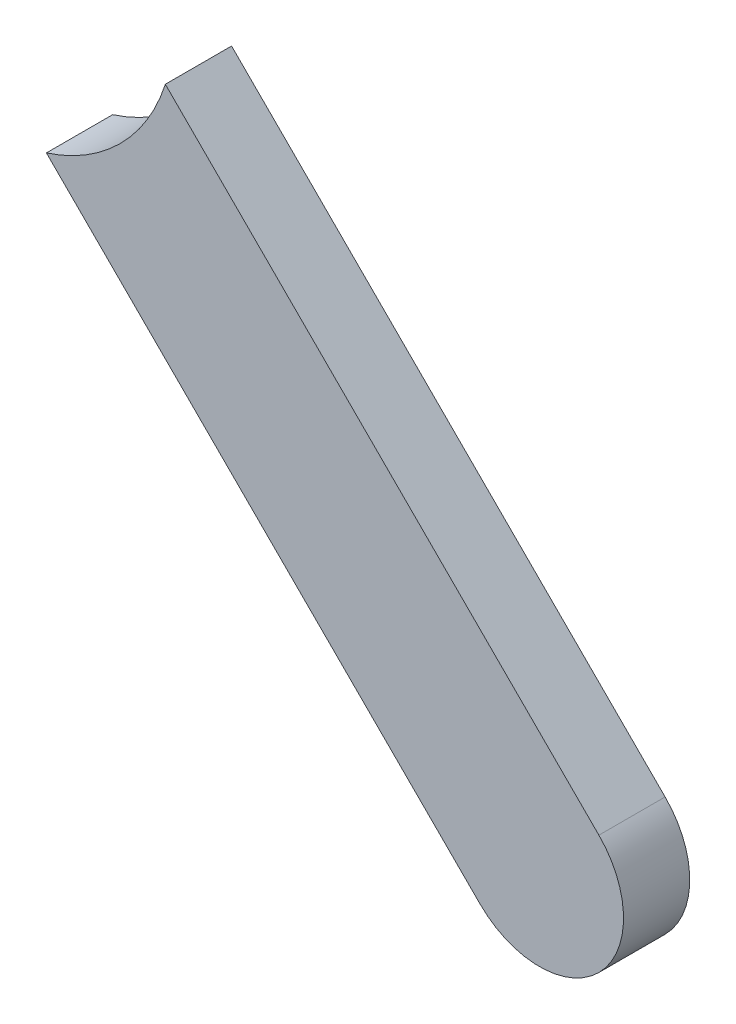
ISO-10303-21;
HEADER;
FILE_DESCRIPTION(('STEP AP214'),'2;1');
FILE_NAME('part.step','',(''),(''),'','','');
FILE_SCHEMA(('AUTOMOTIVE_DESIGN { 1 0 10303 214 1 1 1 1 }'));
ENDSEC;
DATA;
#1=APPLICATION_CONTEXT('core data for automotive mechanical design processes');
#2=APPLICATION_PROTOCOL_DEFINITION('international standard','automotive_design',2000,#1);
#3=PRODUCT_CONTEXT('',#1,'mechanical');
#4=PRODUCT('Part','Part','',(#3));
#5=PRODUCT_RELATED_PRODUCT_CATEGORY('part','',(#4));
#6=PRODUCT_DEFINITION_FORMATION('','',#4);
#7=PRODUCT_DEFINITION_CONTEXT('part definition',#1,'design');
#8=PRODUCT_DEFINITION('design','',#6,#7);
#9=PRODUCT_DEFINITION_SHAPE('','',#8);
#10=(LENGTH_UNIT() NAMED_UNIT(*) SI_UNIT(.MILLI.,.METRE.));
#11=(NAMED_UNIT(*) PLANE_ANGLE_UNIT() SI_UNIT($,.RADIAN.));
#12=(NAMED_UNIT(*) SI_UNIT($,.STERADIAN.) SOLID_ANGLE_UNIT());
#13=UNCERTAINTY_MEASURE_WITH_UNIT(LENGTH_MEASURE(1.E-05),#10,'distance_accuracy_value','');
#14=(GEOMETRIC_REPRESENTATION_CONTEXT(3) GLOBAL_UNCERTAINTY_ASSIGNED_CONTEXT((#13)) GLOBAL_UNIT_ASSIGNED_CONTEXT((#10,
#11,#12)) REPRESENTATION_CONTEXT('',''));
#15=CARTESIAN_POINT('',(0.,0.,0.));
#16=DIRECTION('',(0.,0.,1.));
#17=DIRECTION('',(1.,0.,0.));
#18=AXIS2_PLACEMENT_3D('',#15,#16,#17);
#19=CARTESIAN_POINT('',(129.194064664847,87.9904615951531,0.));
#20=DIRECTION('',(0.707106781186548,0.707106781186548,0.));
#21=DIRECTION('',(0.707106781186548,-0.707106781186548,0.));
#22=AXIS2_PLACEMENT_3D('',#19,#20,#21);
#23=PLANE('',#22);
#24=DIRECTION('',(0.707106781186548,-0.707106781186548,0.));
#25=VECTOR('',#24,1.);
#26=CARTESIAN_POINT('',(128.84512966,88.3393966,0.1999996));
#27=LINE('',#26,#25);
#28=CARTESIAN_POINT('',(129.194064664847,87.9904615951531,0.1999996));
#29=VERTEX_POINT('',#28);
#30=CARTESIAN_POINT('',(130.5033966,86.68112966,0.1999996));
#31=VERTEX_POINT('',#30);
#32=EDGE_CURVE('E11',#29,#31,#27,.T.);
#33=ORIENTED_EDGE('',*,*,#32,.F.);
#34=DIRECTION('',(0.,0.,1.));
#35=VECTOR('',#34,1.);
#36=CARTESIAN_POINT('',(129.194064664847,87.9904615951531,0.));
#37=LINE('',#36,#35);
#38=CARTESIAN_POINT('',(129.194064664847,87.9904615951531,0.));
#39=VERTEX_POINT('',#38);
#40=EDGE_CURVE('E24',#39,#29,#37,.T.);
#41=ORIENTED_EDGE('',*,*,#40,.F.);
#42=DIRECTION('',(0.707106781186548,-0.707106781186548,0.));
#43=VECTOR('',#42,1.);
#44=CARTESIAN_POINT('',(128.84512966,88.3393966,0.));
#45=LINE('',#44,#43);
#46=CARTESIAN_POINT('',(130.5033966,86.68112966,0.));
#47=VERTEX_POINT('',#46);
#48=EDGE_CURVE('E75',#39,#47,#45,.T.);
#49=ORIENTED_EDGE('',*,*,#48,.T.);
#50=DIRECTION('',(0.,0.,1.));
#51=VECTOR('',#50,1.);
#52=CARTESIAN_POINT('',(130.5033966,86.68112966,0.));
#53=LINE('',#52,#51);
#54=EDGE_CURVE('E37',#47,#31,#53,.T.);
#55=ORIENTED_EDGE('',*,*,#54,.T.);
#56=EDGE_LOOP('',(#33,#41,#49,#55));
#57=FACE_BOUND('',#56,.T.);
#58=ADVANCED_FACE('F17',(#57),#23,.F.);
#59=CARTESIAN_POINT('',(130.68300127,86.86073433,0.));
#60=DIRECTION('',(0.,0.,-1.));
#61=DIRECTION('',(-0.707106781186492,-0.707106781186603,0.));
#62=AXIS2_PLACEMENT_3D('',#59,#60,#61);
#63=CYLINDRICAL_SURFACE('',#62,0.253999360179542);
#64=CARTESIAN_POINT('',(130.68300127,86.86073433,0.1999996));
#65=DIRECTION('',(0.,0.,1.));
#66=DIRECTION('',(-0.707106781186492,-0.707106781186603,0.));
#67=AXIS2_PLACEMENT_3D('',#64,#65,#66);
#68=CIRCLE('',#67,0.253999360179542);
#69=CARTESIAN_POINT('',(130.86260594,87.040339,0.1999996));
#70=VERTEX_POINT('',#69);
#71=EDGE_CURVE('E83',#31,#70,#68,.T.);
#72=ORIENTED_EDGE('',*,*,#71,.F.);
#73=ORIENTED_EDGE('',*,*,#54,.F.);
#74=CARTESIAN_POINT('',(130.68300127,86.86073433,0.));
#75=DIRECTION('',(0.,0.,1.));
#76=DIRECTION('',(-0.707106781186492,-0.707106781186603,0.));
#77=AXIS2_PLACEMENT_3D('',#74,#75,#76);
#78=CIRCLE('',#77,0.253999360179542);
#79=CARTESIAN_POINT('',(130.86260594,87.040339,0.));
#80=VERTEX_POINT('',#79);
#81=EDGE_CURVE('E81',#47,#80,#78,.T.);
#82=ORIENTED_EDGE('',*,*,#81,.T.);
#83=DIRECTION('',(0.,0.,1.));
#84=VECTOR('',#83,1.);
#85=CARTESIAN_POINT('',(130.86260594,87.040339,0.));
#86=LINE('',#85,#84);
#87=EDGE_CURVE('E67',#80,#70,#86,.T.);
#88=ORIENTED_EDGE('',*,*,#87,.T.);
#89=EDGE_LOOP('',(#72,#73,#82,#88));
#90=FACE_BOUND('',#89,.T.);
#91=ADVANCED_FACE('F89',(#90),#63,.T.);
#92=CARTESIAN_POINT('',(130.86260594,87.040339,0.));
#93=DIRECTION('',(-0.707106781186545,-0.707106781186551,0.));
#94=DIRECTION('',(-0.707106781186551,0.707106781186545,0.));
#95=AXIS2_PLACEMENT_3D('',#92,#93,#94);
#96=PLANE('',#95);
#97=DIRECTION('',(-0.707106781186551,0.707106781186544,0.));
#98=VECTOR('',#97,1.);
#99=CARTESIAN_POINT('',(130.86260594,87.040339,0.1999996));
#100=LINE('',#99,#98);
#101=CARTESIAN_POINT('',(129.553274004847,88.3496709351531,0.1999996));
#102=VERTEX_POINT('',#101);
#103=EDGE_CURVE('E71',#70,#102,#100,.T.);
#104=ORIENTED_EDGE('',*,*,#103,.F.);
#105=ORIENTED_EDGE('',*,*,#87,.F.);
#106=DIRECTION('',(-0.707106781186551,0.707106781186544,0.));
#107=VECTOR('',#106,1.);
#108=CARTESIAN_POINT('',(130.86260594,87.040339,0.));
#109=LINE('',#108,#107);
#110=CARTESIAN_POINT('',(129.553274004847,88.3496709351531,0.));
#111=VERTEX_POINT('',#110);
#112=EDGE_CURVE('E63',#80,#111,#109,.T.);
#113=ORIENTED_EDGE('',*,*,#112,.T.);
#114=DIRECTION('',(0.,0.,1.));
#115=VECTOR('',#114,1.);
#116=CARTESIAN_POINT('',(129.553274004847,88.3496709351531,0.));
#117=LINE('',#116,#115);
#118=EDGE_CURVE('E53',#111,#102,#117,.T.);
#119=ORIENTED_EDGE('',*,*,#118,.T.);
#120=EDGE_LOOP('',(#104,#105,#113,#119));
#121=FACE_BOUND('',#120,.T.);
#122=ADVANCED_FACE('F66',(#121),#96,.F.);
#123=CARTESIAN_POINT('',(129.0247356,88.519,0.));
#124=DIRECTION('',(0.,0.,-1.));
#125=DIRECTION('',(1.,0.,0.));
#126=AXIS2_PLACEMENT_3D('',#123,#124,#125);
#127=CYLINDRICAL_SURFACE('',#126,0.55500016);
#128=ORIENTED_EDGE('',*,*,#40,.T.);
#129=CARTESIAN_POINT('',(129.0247356,88.519,0.1999996));
#130=DIRECTION('',(0.,0.,1.));
#131=DIRECTION('',(1.,0.,0.));
#132=AXIS2_PLACEMENT_3D('',#129,#130,#131);
#133=CIRCLE('',#132,0.55500016);
#134=EDGE_CURVE('E59',#29,#102,#133,.T.);
#135=ORIENTED_EDGE('',*,*,#134,.T.);
#136=ORIENTED_EDGE('',*,*,#118,.F.);
#137=CARTESIAN_POINT('',(129.0247356,88.519,0.));
#138=DIRECTION('',(0.,0.,1.));
#139=DIRECTION('',(1.,0.,0.));
#140=AXIS2_PLACEMENT_3D('',#137,#138,#139);
#141=CIRCLE('',#140,0.55500016);
#142=EDGE_CURVE('E57',#39,#111,#141,.T.);
#143=ORIENTED_EDGE('',*,*,#142,.F.);
#144=EDGE_LOOP('',(#128,#135,#136,#143));
#145=FACE_BOUND('',#144,.T.);
#146=ADVANCED_FACE('F55',(#145),#127,.F.);
#147=CARTESIAN_POINT('',(128.84512966,88.3393966,0.));
#148=DIRECTION('',(0.,0.,-1.));
#149=DIRECTION('',(-1.,0.,0.));
#150=AXIS2_PLACEMENT_3D('',#147,#148,#149);
#151=PLANE('',#150);
#152=ORIENTED_EDGE('',*,*,#48,.F.);
#153=ORIENTED_EDGE('',*,*,#142,.T.);
#154=ORIENTED_EDGE('',*,*,#112,.F.);
#155=ORIENTED_EDGE('',*,*,#81,.F.);
#156=EDGE_LOOP('',(#152,#153,#154,#155));
#157=FACE_BOUND('',#156,.T.);
#158=ADVANCED_FACE('F74',(#157),#151,.T.);
#159=CARTESIAN_POINT('',(128.84512966,88.3393966,0.1999996));
#160=DIRECTION('',(0.,0.,-1.));
#161=DIRECTION('',(-1.,0.,0.));
#162=AXIS2_PLACEMENT_3D('',#159,#160,#161);
#163=PLANE('',#162);
#164=ORIENTED_EDGE('',*,*,#134,.F.);
#165=ORIENTED_EDGE('',*,*,#32,.T.);
#166=ORIENTED_EDGE('',*,*,#71,.T.);
#167=ORIENTED_EDGE('',*,*,#103,.T.);
#168=EDGE_LOOP('',(#164,#165,#166,#167));
#169=FACE_BOUND('',#168,.T.);
#170=ADVANCED_FACE('F91',(#169),#163,.F.);
#171=CLOSED_SHELL('',(#58,#91,#122,#146,#158,#170));
#172=MANIFOLD_SOLID_BREP('B1',#171);
#173=ADVANCED_BREP_SHAPE_REPRESENTATION('',(#18,#172),#14);
#174=SHAPE_DEFINITION_REPRESENTATION(#9,#173);
ENDSEC;
END-ISO-10303-21;
